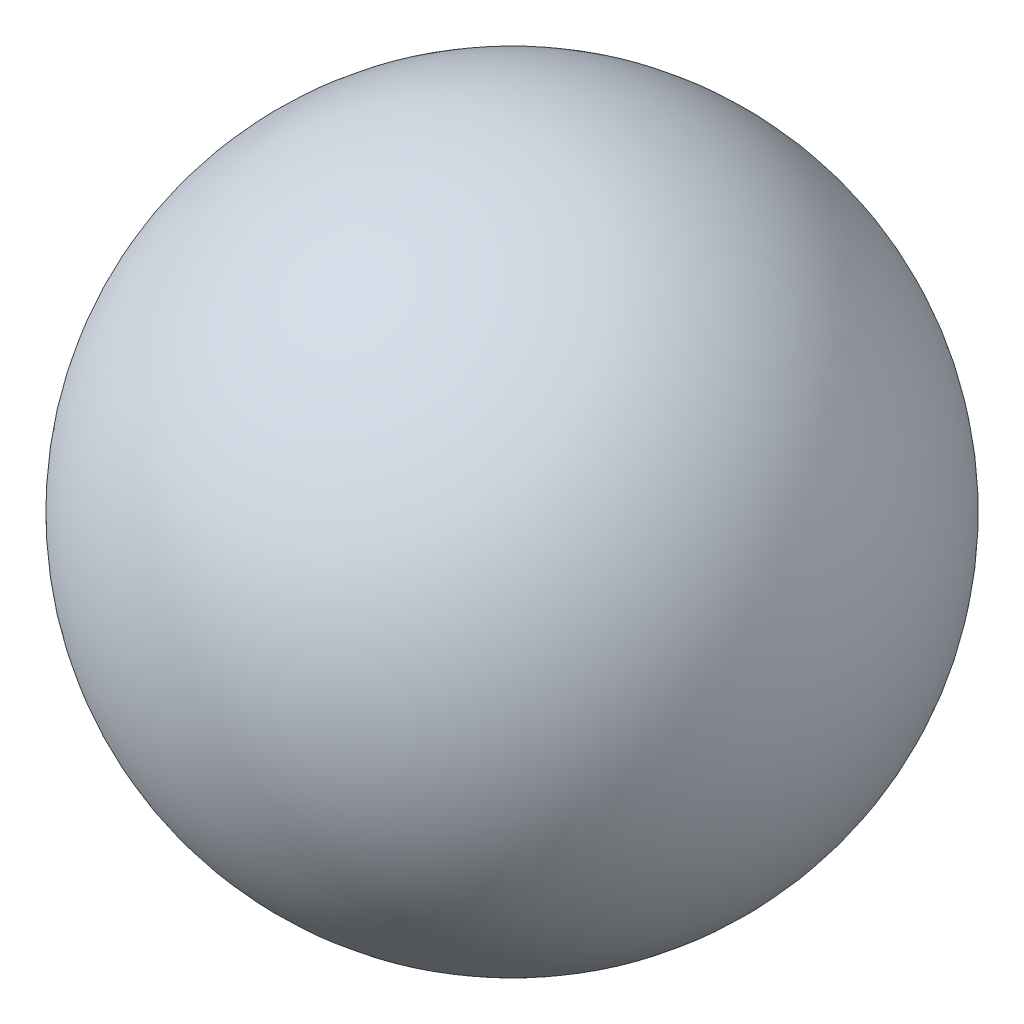
ISO-10303-21;
HEADER;
FILE_DESCRIPTION(('STEP AP214'),'2;1');
FILE_NAME('part.step','',(''),(''),'','','');
FILE_SCHEMA(('AUTOMOTIVE_DESIGN { 1 0 10303 214 1 1 1 1 }'));
ENDSEC;
DATA;
#1=APPLICATION_CONTEXT('core data for automotive mechanical design processes');
#2=APPLICATION_PROTOCOL_DEFINITION('international standard','automotive_design',2000,#1);
#3=PRODUCT_CONTEXT('',#1,'mechanical');
#4=PRODUCT('Part','Part','',(#3));
#5=PRODUCT_RELATED_PRODUCT_CATEGORY('part','',(#4));
#6=PRODUCT_DEFINITION_FORMATION('','',#4);
#7=PRODUCT_DEFINITION_CONTEXT('part definition',#1,'design');
#8=PRODUCT_DEFINITION('design','',#6,#7);
#9=PRODUCT_DEFINITION_SHAPE('','',#8);
#10=(LENGTH_UNIT() NAMED_UNIT(*) SI_UNIT(.MILLI.,.METRE.));
#11=(NAMED_UNIT(*) PLANE_ANGLE_UNIT() SI_UNIT($,.RADIAN.));
#12=(NAMED_UNIT(*) SI_UNIT($,.STERADIAN.) SOLID_ANGLE_UNIT());
#13=UNCERTAINTY_MEASURE_WITH_UNIT(LENGTH_MEASURE(1.E-05),#10,'distance_accuracy_value','');
#14=(GEOMETRIC_REPRESENTATION_CONTEXT(3) GLOBAL_UNCERTAINTY_ASSIGNED_CONTEXT((#13)) GLOBAL_UNIT_ASSIGNED_CONTEXT((#10,
#11,#12)) REPRESENTATION_CONTEXT('',''));
#15=CARTESIAN_POINT('',(0.,0.,0.));
#16=DIRECTION('',(0.,0.,1.));
#17=DIRECTION('',(1.,0.,0.));
#18=AXIS2_PLACEMENT_3D('',#15,#16,#17);
#19=CARTESIAN_POINT('',(0.,0.,0.));
#20=DIRECTION('',(0.,1.,0.));
#21=DIRECTION('',(1.,0.,0.));
#22=AXIS2_PLACEMENT_3D('',#19,#20,#21);
#23=SPHERICAL_SURFACE('',#22,4.);
#24=CARTESIAN_POINT('',(0.,4.,0.));
#25=VERTEX_POINT('',#24);
#26=VERTEX_LOOP('',#25);
#27=FACE_BOUND('',#26,.T.);
#28=ADVANCED_FACE('F35',(#27),#23,.T.);
#29=CLOSED_SHELL('',(#28));
#30=MANIFOLD_SOLID_BREP('B2',#29);
#31=ADVANCED_BREP_SHAPE_REPRESENTATION('',(#18,#30),#14);
#32=SHAPE_DEFINITION_REPRESENTATION(#9,#31);
ENDSEC;
END-ISO-10303-21;
